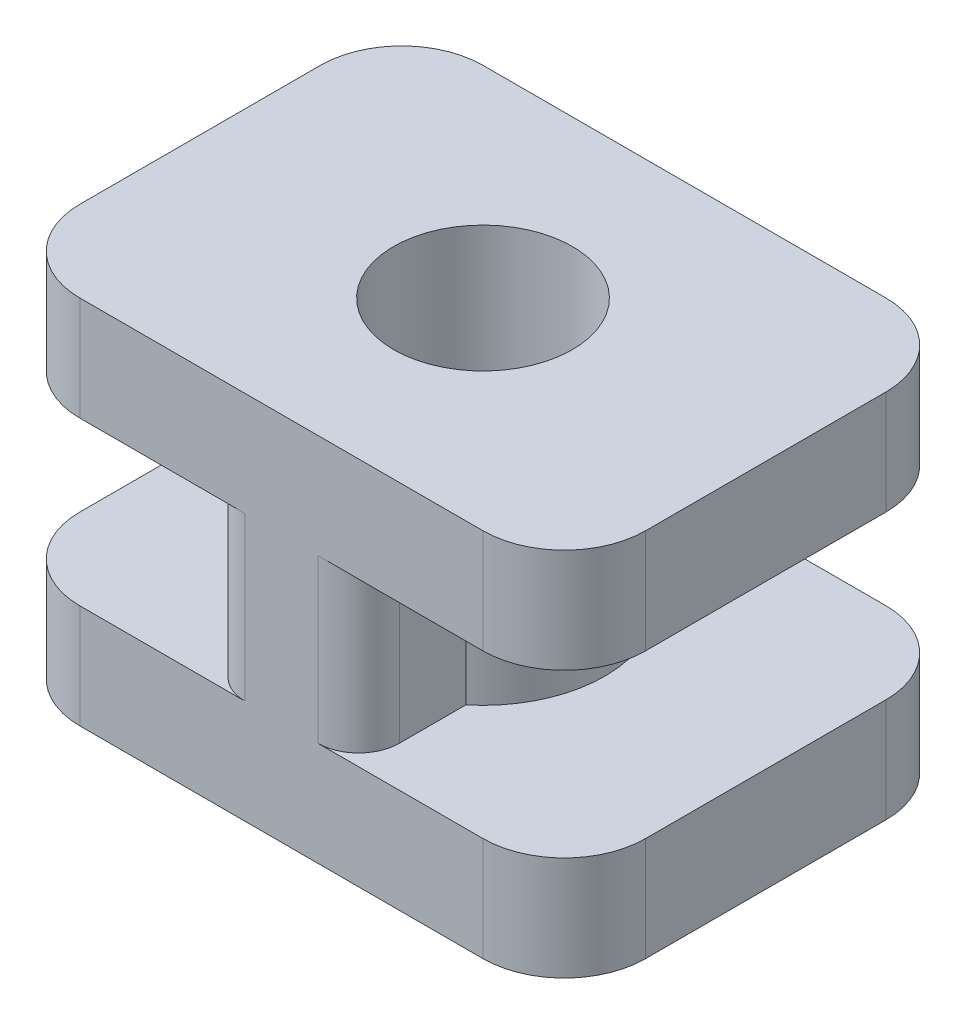
ISO-10303-21;
HEADER;
FILE_DESCRIPTION(('STEP AP214'),'2;1');
FILE_NAME('part.step','',(''),(''),'','','');
FILE_SCHEMA(('AUTOMOTIVE_DESIGN { 1 0 10303 214 1 1 1 1 }'));
ENDSEC;
DATA;
#1=APPLICATION_CONTEXT('core data for automotive mechanical design processes');
#2=APPLICATION_PROTOCOL_DEFINITION('international standard','automotive_design',2000,#1);
#3=PRODUCT_CONTEXT('',#1,'mechanical');
#4=PRODUCT('Part','Part','',(#3));
#5=PRODUCT_RELATED_PRODUCT_CATEGORY('part','',(#4));
#6=PRODUCT_DEFINITION_FORMATION('','',#4);
#7=PRODUCT_DEFINITION_CONTEXT('part definition',#1,'design');
#8=PRODUCT_DEFINITION('design','',#6,#7);
#9=PRODUCT_DEFINITION_SHAPE('','',#8);
#10=(LENGTH_UNIT() NAMED_UNIT(*) SI_UNIT(.MILLI.,.METRE.));
#11=(NAMED_UNIT(*) PLANE_ANGLE_UNIT() SI_UNIT($,.RADIAN.));
#12=(NAMED_UNIT(*) SI_UNIT($,.STERADIAN.) SOLID_ANGLE_UNIT());
#13=UNCERTAINTY_MEASURE_WITH_UNIT(LENGTH_MEASURE(1.E-05),#10,'distance_accuracy_value','');
#14=(GEOMETRIC_REPRESENTATION_CONTEXT(3) GLOBAL_UNCERTAINTY_ASSIGNED_CONTEXT((#13)) GLOBAL_UNIT_ASSIGNED_CONTEXT((#10,
#11,#12)) REPRESENTATION_CONTEXT('',''));
#15=CARTESIAN_POINT('',(0.,0.,0.));
#16=DIRECTION('',(0.,0.,1.));
#17=DIRECTION('',(1.,0.,0.));
#18=AXIS2_PLACEMENT_3D('',#15,#16,#17);
#19=CARTESIAN_POINT('',(1.2065,1.6256,3.1496));
#20=DIRECTION('',(-1.,0.,0.));
#21=DIRECTION('',(0.,0.,1.));
#22=AXIS2_PLACEMENT_3D('',#19,#20,#21);
#23=PLANE('',#22);
#24=DIRECTION('',(0.,0.,1.));
#25=VECTOR('',#24,1.);
#26=CARTESIAN_POINT('',(1.2065,4.1656,3.1496));
#27=LINE('',#26,#25);
#28=CARTESIAN_POINT('',(1.2065,4.1656,1.47423971931298));
#29=VERTEX_POINT('',#28);
#30=CARTESIAN_POINT('',(1.2065,4.1656,2.5146));
#31=VERTEX_POINT('',#30);
#32=EDGE_CURVE('E354',#29,#31,#27,.T.);
#33=ORIENTED_EDGE('',*,*,#32,.T.);
#34=DIRECTION('',(0.,1.,0.));
#35=VECTOR('',#34,1.);
#36=CARTESIAN_POINT('',(1.2065,1.6256,2.5146));
#37=LINE('',#36,#35);
#38=CARTESIAN_POINT('',(1.2065,1.6256,2.5146));
#39=VERTEX_POINT('',#38);
#40=EDGE_CURVE('E203',#31,#39,#37,.F.);
#41=ORIENTED_EDGE('',*,*,#40,.T.);
#42=DIRECTION('',(0.,0.,1.));
#43=VECTOR('',#42,1.);
#44=CARTESIAN_POINT('',(1.2065,1.6256,3.1496));
#45=LINE('',#44,#43);
#46=CARTESIAN_POINT('',(1.2065,1.6256,1.47423971931298));
#47=VERTEX_POINT('',#46);
#48=EDGE_CURVE('E187',#47,#39,#45,.T.);
#49=ORIENTED_EDGE('',*,*,#48,.F.);
#50=DIRECTION('',(0.,1.,0.));
#51=VECTOR('',#50,1.);
#52=CARTESIAN_POINT('',(1.2065,1.6256,1.47423971931298));
#53=LINE('',#52,#51);
#54=EDGE_CURVE('E200',#47,#29,#53,.T.);
#55=ORIENTED_EDGE('',*,*,#54,.T.);
#56=EDGE_LOOP('',(#33,#41,#49,#55));
#57=FACE_BOUND('',#56,.T.);
#58=ADVANCED_FACE('F32',(#57),#23,.F.);
#59=CARTESIAN_POINT('',(4.4196,5.7912,-3.1496));
#60=DIRECTION('',(1.,0.,0.));
#61=DIRECTION('',(0.,0.,-1.));
#62=AXIS2_PLACEMENT_3D('',#59,#60,#61);
#63=PLANE('',#62);
#64=DIRECTION('',(0.,0.,1.));
#65=VECTOR('',#64,1.);
#66=CARTESIAN_POINT('',(4.4196,4.1656,-3.1496));
#67=LINE('',#66,#65);
#68=CARTESIAN_POINT('',(4.4196,4.1656,-1.8796));
#69=VERTEX_POINT('',#68);
#70=CARTESIAN_POINT('',(4.4196,4.1656,1.8796));
#71=VERTEX_POINT('',#70);
#72=EDGE_CURVE('E210',#69,#71,#67,.T.);
#73=ORIENTED_EDGE('',*,*,#72,.F.);
#74=DIRECTION('',(0.,-1.,0.));
#75=VECTOR('',#74,1.);
#76=CARTESIAN_POINT('',(4.4196,5.7912,-1.8796));
#77=LINE('',#76,#75);
#78=CARTESIAN_POINT('',(4.4196,5.7912,-1.8796));
#79=VERTEX_POINT('',#78);
#80=EDGE_CURVE('E314',#69,#79,#77,.F.);
#81=ORIENTED_EDGE('',*,*,#80,.T.);
#82=DIRECTION('',(0.,0.,1.));
#83=VECTOR('',#82,1.);
#84=CARTESIAN_POINT('',(4.4196,5.7912,-3.1496));
#85=LINE('',#84,#83);
#86=CARTESIAN_POINT('',(4.4196,5.7912,1.8796));
#87=VERTEX_POINT('',#86);
#88=EDGE_CURVE('E219',#79,#87,#85,.T.);
#89=ORIENTED_EDGE('',*,*,#88,.T.);
#90=DIRECTION('',(0.,-1.,0.));
#91=VECTOR('',#90,1.);
#92=CARTESIAN_POINT('',(4.4196,5.7912,1.8796));
#93=LINE('',#92,#91);
#94=EDGE_CURVE('E311',#87,#71,#93,.T.);
#95=ORIENTED_EDGE('',*,*,#94,.T.);
#96=EDGE_LOOP('',(#73,#81,#89,#95));
#97=FACE_BOUND('',#96,.T.);
#98=ADVANCED_FACE('F337',(#97),#63,.T.);
#99=CARTESIAN_POINT('',(-4.4196,5.7912,-3.1496));
#100=DIRECTION('',(0.,0.,-1.));
#101=DIRECTION('',(-1.,0.,0.));
#102=AXIS2_PLACEMENT_3D('',#99,#100,#101);
#103=PLANE('',#102);
#104=DIRECTION('',(1.,0.,0.));
#105=VECTOR('',#104,1.);
#106=CARTESIAN_POINT('',(-4.4196,5.7912,-3.1496));
#107=LINE('',#106,#105);
#108=CARTESIAN_POINT('',(-3.1496,5.7912,-3.1496));
#109=VERTEX_POINT('',#108);
#110=CARTESIAN_POINT('',(3.1496,5.7912,-3.1496));
#111=VERTEX_POINT('',#110);
#112=EDGE_CURVE('E228',#109,#111,#107,.T.);
#113=ORIENTED_EDGE('',*,*,#112,.T.);
#114=DIRECTION('',(0.,-1.,0.));
#115=VECTOR('',#114,1.);
#116=CARTESIAN_POINT('',(3.1496,5.7912,-3.1496));
#117=LINE('',#116,#115);
#118=CARTESIAN_POINT('',(3.1496,4.1656,-3.1496));
#119=VERTEX_POINT('',#118);
#120=EDGE_CURVE('E300',#111,#119,#117,.T.);
#121=ORIENTED_EDGE('',*,*,#120,.T.);
#122=DIRECTION('',(1.,0.,0.));
#123=VECTOR('',#122,1.);
#124=CARTESIAN_POINT('',(-4.4196,4.1656,-3.1496));
#125=LINE('',#124,#123);
#126=CARTESIAN_POINT('',(-3.1496,4.1656,-3.1496));
#127=VERTEX_POINT('',#126);
#128=EDGE_CURVE('E223',#127,#119,#125,.T.);
#129=ORIENTED_EDGE('',*,*,#128,.F.);
#130=DIRECTION('',(0.,-1.,0.));
#131=VECTOR('',#130,1.);
#132=CARTESIAN_POINT('',(-3.1496,5.7912,-3.1496));
#133=LINE('',#132,#131);
#134=EDGE_CURVE('E298',#127,#109,#133,.F.);
#135=ORIENTED_EDGE('',*,*,#134,.T.);
#136=EDGE_LOOP('',(#113,#121,#129,#135));
#137=FACE_BOUND('',#136,.T.);
#138=ADVANCED_FACE('F329',(#137),#103,.T.);
#139=CARTESIAN_POINT('',(-4.4196,5.7912,3.1496));
#140=DIRECTION('',(-1.,0.,0.));
#141=DIRECTION('',(0.,0.,1.));
#142=AXIS2_PLACEMENT_3D('',#139,#140,#141);
#143=PLANE('',#142);
#144=DIRECTION('',(0.,0.,-1.));
#145=VECTOR('',#144,1.);
#146=CARTESIAN_POINT('',(-4.4196,5.7912,3.1496));
#147=LINE('',#146,#145);
#148=CARTESIAN_POINT('',(-4.4196,5.7912,1.8796));
#149=VERTEX_POINT('',#148);
#150=CARTESIAN_POINT('',(-4.4196,5.7912,-1.8796));
#151=VERTEX_POINT('',#150);
#152=EDGE_CURVE('E226',#149,#151,#147,.T.);
#153=ORIENTED_EDGE('',*,*,#152,.T.);
#154=DIRECTION('',(0.,-1.,0.));
#155=VECTOR('',#154,1.);
#156=CARTESIAN_POINT('',(-4.4196,5.7912,-1.8796));
#157=LINE('',#156,#155);
#158=CARTESIAN_POINT('',(-4.4196,4.1656,-1.8796));
#159=VERTEX_POINT('',#158);
#160=EDGE_CURVE('E11',#151,#159,#157,.T.);
#161=ORIENTED_EDGE('',*,*,#160,.T.);
#162=DIRECTION('',(0.,0.,-1.));
#163=VECTOR('',#162,1.);
#164=CARTESIAN_POINT('',(-4.4196,4.1656,3.1496));
#165=LINE('',#164,#163);
#166=CARTESIAN_POINT('',(-4.4196,4.1656,1.8796));
#167=VERTEX_POINT('',#166);
#168=EDGE_CURVE('E234',#167,#159,#165,.T.);
#169=ORIENTED_EDGE('',*,*,#168,.F.);
#170=DIRECTION('',(0.,-1.,0.));
#171=VECTOR('',#170,1.);
#172=CARTESIAN_POINT('',(-4.4196,5.7912,1.8796));
#173=LINE('',#172,#171);
#174=EDGE_CURVE('E40',#167,#149,#173,.F.);
#175=ORIENTED_EDGE('',*,*,#174,.T.);
#176=EDGE_LOOP('',(#153,#161,#169,#175));
#177=FACE_BOUND('',#176,.T.);
#178=ADVANCED_FACE('F397',(#177),#143,.T.);
#179=CARTESIAN_POINT('',(4.4196,5.7912,3.1496));
#180=DIRECTION('',(0.,0.,1.));
#181=DIRECTION('',(1.,0.,0.));
#182=AXIS2_PLACEMENT_3D('',#179,#180,#181);
#183=PLANE('',#182);
#184=DIRECTION('',(-1.,0.,0.));
#185=VECTOR('',#184,1.);
#186=CARTESIAN_POINT('',(-4.4196,1.6256,3.1496));
#187=LINE('',#186,#185);
#188=CARTESIAN_POINT('',(-0.5715,1.6256,3.1496));
#189=VERTEX_POINT('',#188);
#190=CARTESIAN_POINT('',(-3.1496,1.6256,3.1496));
#191=VERTEX_POINT('',#190);
#192=EDGE_CURVE('E367',#189,#191,#187,.T.);
#193=ORIENTED_EDGE('',*,*,#192,.T.);
#194=DIRECTION('',(0.,1.,0.));
#195=VECTOR('',#194,1.);
#196=CARTESIAN_POINT('',(-3.1496,0.,3.1496));
#197=LINE('',#196,#195);
#198=CARTESIAN_POINT('',(-3.1496,0.,3.1496));
#199=VERTEX_POINT('',#198);
#200=EDGE_CURVE('E296',#191,#199,#197,.F.);
#201=ORIENTED_EDGE('',*,*,#200,.T.);
#202=DIRECTION('',(-1.,0.,0.));
#203=VECTOR('',#202,1.);
#204=CARTESIAN_POINT('',(-4.4196,0.,3.1496));
#205=LINE('',#204,#203);
#206=CARTESIAN_POINT('',(3.1496,0.,3.1496));
#207=VERTEX_POINT('',#206);
#208=EDGE_CURVE('E363',#207,#199,#205,.T.);
#209=ORIENTED_EDGE('',*,*,#208,.F.);
#210=DIRECTION('',(0.,-1.,0.));
#211=VECTOR('',#210,1.);
#212=CARTESIAN_POINT('',(3.1496,1.6256,3.1496));
#213=LINE('',#212,#211);
#214=CARTESIAN_POINT('',(3.1496,1.6256,3.1496));
#215=VERTEX_POINT('',#214);
#216=EDGE_CURVE('E294',#207,#215,#213,.F.);
#217=ORIENTED_EDGE('',*,*,#216,.T.);
#218=DIRECTION('',(-1.,0.,0.));
#219=VECTOR('',#218,1.);
#220=CARTESIAN_POINT('',(4.4196,1.6256,3.1496));
#221=LINE('',#220,#219);
#222=CARTESIAN_POINT('',(0.571499999999999,1.6256,3.1496));
#223=VERTEX_POINT('',#222);
#224=EDGE_CURVE('E351',#215,#223,#221,.T.);
#225=ORIENTED_EDGE('',*,*,#224,.T.);
#226=DIRECTION('',(0.,1.,0.));
#227=VECTOR('',#226,1.);
#228=CARTESIAN_POINT('',(0.571499999999999,4.1656,3.1496));
#229=LINE('',#228,#227);
#230=CARTESIAN_POINT('',(0.571499999999999,4.1656,3.1496));
#231=VERTEX_POINT('',#230);
#232=EDGE_CURVE('E241',#223,#231,#229,.T.);
#233=ORIENTED_EDGE('',*,*,#232,.T.);
#234=DIRECTION('',(-1.,0.,0.));
#235=VECTOR('',#234,1.);
#236=CARTESIAN_POINT('',(4.4196,4.1656,3.1496));
#237=LINE('',#236,#235);
#238=CARTESIAN_POINT('',(3.1496,4.1656,3.1496));
#239=VERTEX_POINT('',#238);
#240=EDGE_CURVE('E232',#239,#231,#237,.T.);
#241=ORIENTED_EDGE('',*,*,#240,.F.);
#242=DIRECTION('',(0.,-1.,0.));
#243=VECTOR('',#242,1.);
#244=CARTESIAN_POINT('',(3.1496,5.7912,3.1496));
#245=LINE('',#244,#243);
#246=CARTESIAN_POINT('',(3.1496,5.7912,3.1496));
#247=VERTEX_POINT('',#246);
#248=EDGE_CURVE('E292',#239,#247,#245,.F.);
#249=ORIENTED_EDGE('',*,*,#248,.T.);
#250=DIRECTION('',(-1.,0.,0.));
#251=VECTOR('',#250,1.);
#252=CARTESIAN_POINT('',(4.4196,5.7912,3.1496));
#253=LINE('',#252,#251);
#254=CARTESIAN_POINT('',(-3.1496,5.7912,3.1496));
#255=VERTEX_POINT('',#254);
#256=EDGE_CURVE('E222',#247,#255,#253,.T.);
#257=ORIENTED_EDGE('',*,*,#256,.T.);
#258=DIRECTION('',(0.,-1.,0.));
#259=VECTOR('',#258,1.);
#260=CARTESIAN_POINT('',(-3.1496,5.7912,3.1496));
#261=LINE('',#260,#259);
#262=CARTESIAN_POINT('',(-3.1496,4.1656,3.1496));
#263=VERTEX_POINT('',#262);
#264=EDGE_CURVE('E289',#255,#263,#261,.T.);
#265=ORIENTED_EDGE('',*,*,#264,.T.);
#266=CARTESIAN_POINT('',(-0.5715,4.1656,3.1496));
#267=VERTEX_POINT('',#266);
#268=EDGE_CURVE('E214',#267,#263,#237,.T.);
#269=ORIENTED_EDGE('',*,*,#268,.F.);
#270=DIRECTION('',(0.,1.,0.));
#271=VECTOR('',#270,1.);
#272=CARTESIAN_POINT('',(-0.5715,1.6256,3.1496));
#273=LINE('',#272,#271);
#274=EDGE_CURVE('E230',#267,#189,#273,.F.);
#275=ORIENTED_EDGE('',*,*,#274,.T.);
#276=EDGE_LOOP('',(#193,#201,#209,#217,#225,#233,#241,#249,#257,#265,#269,#275));
#277=FACE_BOUND('',#276,.T.);
#278=ADVANCED_FACE('F347',(#277),#183,.T.);
#279=CARTESIAN_POINT('',(0.,5.7912,0.));
#280=DIRECTION('',(0.,-1.,0.));
#281=DIRECTION('',(0.,0.,-1.));
#282=AXIS2_PLACEMENT_3D('',#279,#280,#281);
#283=PLANE('',#282);
#284=CARTESIAN_POINT('',(0.,5.7912,0.));
#285=DIRECTION('',(0.,1.,0.));
#286=DIRECTION('',(0.,0.,1.));
#287=AXIS2_PLACEMENT_3D('',#284,#285,#286);
#288=CIRCLE('',#287,1.39699999999999);
#289=CARTESIAN_POINT('',(0.,5.7912,1.39699999999999));
#290=VERTEX_POINT('',#289);
#291=EDGE_CURVE('E384',#290,#290,#288,.T.);
#292=ORIENTED_EDGE('',*,*,#291,.F.);
#293=EDGE_LOOP('',(#292));
#294=FACE_BOUND('',#293,.T.);
#295=ORIENTED_EDGE('',*,*,#88,.F.);
#296=CARTESIAN_POINT('',(3.1496,5.7912,-1.8796));
#297=DIRECTION('',(0.,-1.,0.));
#298=DIRECTION('',(0.,0.,-1.));
#299=AXIS2_PLACEMENT_3D('',#296,#297,#298);
#300=CIRCLE('',#299,1.27);
#301=EDGE_CURVE('E321',#79,#111,#300,.F.);
#302=ORIENTED_EDGE('',*,*,#301,.T.);
#303=ORIENTED_EDGE('',*,*,#112,.F.);
#304=CARTESIAN_POINT('',(-3.1496,5.7912,-1.8796));
#305=DIRECTION('',(0.,-1.,0.));
#306=DIRECTION('',(0.,0.,-1.));
#307=AXIS2_PLACEMENT_3D('',#304,#305,#306);
#308=CIRCLE('',#307,1.27);
#309=EDGE_CURVE('E47',#109,#151,#308,.F.);
#310=ORIENTED_EDGE('',*,*,#309,.T.);
#311=ORIENTED_EDGE('',*,*,#152,.F.);
#312=CARTESIAN_POINT('',(-3.1496,5.7912,1.8796));
#313=DIRECTION('',(0.,-1.,0.));
#314=DIRECTION('',(0.,0.,-1.));
#315=AXIS2_PLACEMENT_3D('',#312,#313,#314);
#316=CIRCLE('',#315,1.27);
#317=EDGE_CURVE('E316',#149,#255,#316,.F.);
#318=ORIENTED_EDGE('',*,*,#317,.T.);
#319=ORIENTED_EDGE('',*,*,#256,.F.);
#320=CARTESIAN_POINT('',(3.1496,5.7912,1.8796));
#321=DIRECTION('',(0.,-1.,0.));
#322=DIRECTION('',(0.,0.,-1.));
#323=AXIS2_PLACEMENT_3D('',#320,#321,#322);
#324=CIRCLE('',#323,1.27);
#325=EDGE_CURVE('E318',#247,#87,#324,.F.);
#326=ORIENTED_EDGE('',*,*,#325,.T.);
#327=EDGE_LOOP('',(#295,#302,#303,#310,#311,#318,#319,#326));
#328=FACE_BOUND('',#327,.T.);
#329=ADVANCED_FACE('F324',(#294,#328),#283,.F.);
#330=CARTESIAN_POINT('',(0.,4.1656,0.));
#331=DIRECTION('',(0.,-1.,0.));
#332=DIRECTION('',(0.,0.,-1.));
#333=AXIS2_PLACEMENT_3D('',#330,#331,#332);
#334=PLANE('',#333);
#335=ORIENTED_EDGE('',*,*,#128,.T.);
#336=CARTESIAN_POINT('',(3.1496,4.1656,-1.8796));
#337=DIRECTION('',(0.,-1.,0.));
#338=DIRECTION('',(0.,0.,-1.));
#339=AXIS2_PLACEMENT_3D('',#336,#337,#338);
#340=CIRCLE('',#339,1.27);
#341=EDGE_CURVE('E309',#119,#69,#340,.T.);
#342=ORIENTED_EDGE('',*,*,#341,.T.);
#343=ORIENTED_EDGE('',*,*,#72,.T.);
#344=CARTESIAN_POINT('',(3.1496,4.1656,1.8796));
#345=DIRECTION('',(0.,-1.,0.));
#346=DIRECTION('',(0.,0.,-1.));
#347=AXIS2_PLACEMENT_3D('',#344,#345,#346);
#348=CIRCLE('',#347,1.27);
#349=EDGE_CURVE('E305',#71,#239,#348,.T.);
#350=ORIENTED_EDGE('',*,*,#349,.T.);
#351=ORIENTED_EDGE('',*,*,#240,.T.);
#352=CARTESIAN_POINT('',(0.571499999999999,4.1656,2.5146));
#353=DIRECTION('',(0.,-1.,0.));
#354=DIRECTION('',(0.,0.,-1.));
#355=AXIS2_PLACEMENT_3D('',#352,#353,#354);
#356=CIRCLE('',#355,0.635);
#357=EDGE_CURVE('E248',#231,#31,#356,.F.);
#358=ORIENTED_EDGE('',*,*,#357,.T.);
#359=ORIENTED_EDGE('',*,*,#32,.F.);
#360=CARTESIAN_POINT('',(0.,4.1656,0.));
#361=DIRECTION('',(0.,-1.,0.));
#362=DIRECTION('',(0.,0.,1.));
#363=AXIS2_PLACEMENT_3D('',#360,#361,#362);
#364=CIRCLE('',#363,1.905);
#365=CARTESIAN_POINT('',(-1.2065,4.1656,1.47423971931297));
#366=VERTEX_POINT('',#365);
#367=EDGE_CURVE('E209',#366,#29,#364,.T.);
#368=ORIENTED_EDGE('',*,*,#367,.F.);
#369=DIRECTION('',(0.,0.,-1.));
#370=VECTOR('',#369,1.);
#371=CARTESIAN_POINT('',(-1.2065,4.1656,1.47423971931297));
#372=LINE('',#371,#370);
#373=CARTESIAN_POINT('',(-1.2065,4.1656,2.5146));
#374=VERTEX_POINT('',#373);
#375=EDGE_CURVE('E195',#374,#366,#372,.T.);
#376=ORIENTED_EDGE('',*,*,#375,.F.);
#377=CARTESIAN_POINT('',(-0.5715,4.1656,2.5146));
#378=DIRECTION('',(0.,-1.,0.));
#379=DIRECTION('',(0.,0.,-1.));
#380=AXIS2_PLACEMENT_3D('',#377,#378,#379);
#381=CIRCLE('',#380,0.635);
#382=EDGE_CURVE('E252',#374,#267,#381,.F.);
#383=ORIENTED_EDGE('',*,*,#382,.T.);
#384=ORIENTED_EDGE('',*,*,#268,.T.);
#385=CARTESIAN_POINT('',(-3.1496,4.1656,1.8796));
#386=DIRECTION('',(0.,-1.,0.));
#387=DIRECTION('',(0.,0.,-1.));
#388=AXIS2_PLACEMENT_3D('',#385,#386,#387);
#389=CIRCLE('',#388,1.27);
#390=EDGE_CURVE('E303',#263,#167,#389,.T.);
#391=ORIENTED_EDGE('',*,*,#390,.T.);
#392=ORIENTED_EDGE('',*,*,#168,.T.);
#393=CARTESIAN_POINT('',(-3.1496,4.1656,-1.8796));
#394=DIRECTION('',(0.,-1.,0.));
#395=DIRECTION('',(0.,0.,-1.));
#396=AXIS2_PLACEMENT_3D('',#393,#394,#395);
#397=CIRCLE('',#396,1.27);
#398=EDGE_CURVE('E307',#159,#127,#397,.T.);
#399=ORIENTED_EDGE('',*,*,#398,.T.);
#400=EDGE_LOOP('',(#335,#342,#343,#350,#351,#358,#359,#368,#376,#383,#384,#391,#392,#399));
#401=FACE_BOUND('',#400,.T.);
#402=ADVANCED_FACE('F335',(#401),#334,.T.);
#403=CARTESIAN_POINT('',(0.,1.6256,0.));
#404=DIRECTION('',(0.,1.,0.));
#405=DIRECTION('',(0.,0.,1.));
#406=AXIS2_PLACEMENT_3D('',#403,#404,#405);
#407=CYLINDRICAL_SURFACE('',#406,1.905);
#408=ORIENTED_EDGE('',*,*,#367,.T.);
#409=ORIENTED_EDGE('',*,*,#54,.F.);
#410=CARTESIAN_POINT('',(0.,1.6256,0.));
#411=DIRECTION('',(0.,-1.,0.));
#412=DIRECTION('',(0.,0.,1.));
#413=AXIS2_PLACEMENT_3D('',#410,#411,#412);
#414=CIRCLE('',#413,1.905);
#415=CARTESIAN_POINT('',(-1.2065,1.6256,1.47423971931297));
#416=VERTEX_POINT('',#415);
#417=EDGE_CURVE('E182',#416,#47,#414,.T.);
#418=ORIENTED_EDGE('',*,*,#417,.F.);
#419=DIRECTION('',(0.,1.,0.));
#420=VECTOR('',#419,1.);
#421=CARTESIAN_POINT('',(-1.2065,1.6256,1.47423971931297));
#422=LINE('',#421,#420);
#423=EDGE_CURVE('E211',#416,#366,#422,.T.);
#424=ORIENTED_EDGE('',*,*,#423,.T.);
#425=EDGE_LOOP('',(#408,#409,#418,#424));
#426=FACE_BOUND('',#425,.T.);
#427=ADVANCED_FACE('F207',(#426),#407,.T.);
#428=CARTESIAN_POINT('',(-1.2065,1.6256,1.47423971931297));
#429=DIRECTION('',(1.,0.,0.));
#430=DIRECTION('',(0.,0.,-1.));
#431=AXIS2_PLACEMENT_3D('',#428,#429,#430);
#432=PLANE('',#431);
#433=DIRECTION('',(0.,0.,-1.));
#434=VECTOR('',#433,1.);
#435=CARTESIAN_POINT('',(-1.2065,1.6256,1.47423971931297));
#436=LINE('',#435,#434);
#437=CARTESIAN_POINT('',(-1.2065,1.6256,2.5146));
#438=VERTEX_POINT('',#437);
#439=EDGE_CURVE('E190',#438,#416,#436,.T.);
#440=ORIENTED_EDGE('',*,*,#439,.F.);
#441=DIRECTION('',(0.,1.,0.));
#442=VECTOR('',#441,1.);
#443=CARTESIAN_POINT('',(-1.2065,4.1656,2.5146));
#444=LINE('',#443,#442);
#445=EDGE_CURVE('E245',#438,#374,#444,.T.);
#446=ORIENTED_EDGE('',*,*,#445,.T.);
#447=ORIENTED_EDGE('',*,*,#375,.T.);
#448=ORIENTED_EDGE('',*,*,#423,.F.);
#449=EDGE_LOOP('',(#440,#446,#447,#448));
#450=FACE_BOUND('',#449,.T.);
#451=ADVANCED_FACE('F407',(#450),#432,.F.);
#452=CARTESIAN_POINT('',(-4.4196,0.,-3.1496));
#453=DIRECTION('',(1.,0.,0.));
#454=DIRECTION('',(0.,0.,-1.));
#455=AXIS2_PLACEMENT_3D('',#452,#453,#454);
#456=PLANE('',#455);
#457=DIRECTION('',(0.,0.,-1.));
#458=VECTOR('',#457,1.);
#459=CARTESIAN_POINT('',(-4.4196,0.,-3.1496));
#460=LINE('',#459,#458);
#461=CARTESIAN_POINT('',(-4.4196,0.,1.8796));
#462=VERTEX_POINT('',#461);
#463=CARTESIAN_POINT('',(-4.4196,0.,-1.8796));
#464=VERTEX_POINT('',#463);
#465=EDGE_CURVE('E371',#462,#464,#460,.T.);
#466=ORIENTED_EDGE('',*,*,#465,.F.);
#467=DIRECTION('',(0.,1.,0.));
#468=VECTOR('',#467,1.);
#469=CARTESIAN_POINT('',(-4.4196,1.6256,1.8796));
#470=LINE('',#469,#468);
#471=CARTESIAN_POINT('',(-4.4196,1.6256,1.8796));
#472=VERTEX_POINT('',#471);
#473=EDGE_CURVE('E286',#462,#472,#470,.T.);
#474=ORIENTED_EDGE('',*,*,#473,.T.);
#475=DIRECTION('',(0.,0.,-1.));
#476=VECTOR('',#475,1.);
#477=CARTESIAN_POINT('',(-4.4196,1.6256,-3.1496));
#478=LINE('',#477,#476);
#479=CARTESIAN_POINT('',(-4.4196,1.6256,-1.8796));
#480=VERTEX_POINT('',#479);
#481=EDGE_CURVE('E364',#472,#480,#478,.T.);
#482=ORIENTED_EDGE('',*,*,#481,.T.);
#483=DIRECTION('',(0.,1.,0.));
#484=VECTOR('',#483,1.);
#485=CARTESIAN_POINT('',(-4.4196,0.,-1.8796));
#486=LINE('',#485,#484);
#487=EDGE_CURVE('E284',#480,#464,#486,.F.);
#488=ORIENTED_EDGE('',*,*,#487,.T.);
#489=EDGE_LOOP('',(#466,#474,#482,#488));
#490=FACE_BOUND('',#489,.T.);
#491=ADVANCED_FACE('F413',(#490),#456,.F.);
#492=CARTESIAN_POINT('',(1.2065,0.,-3.1496));
#493=DIRECTION('',(0.,0.,1.));
#494=DIRECTION('',(1.,0.,0.));
#495=AXIS2_PLACEMENT_3D('',#492,#493,#494);
#496=PLANE('',#495);
#497=DIRECTION('',(1.,0.,0.));
#498=VECTOR('',#497,1.);
#499=CARTESIAN_POINT('',(1.2065,1.6256,-3.1496));
#500=LINE('',#499,#498);
#501=CARTESIAN_POINT('',(-3.1496,1.6256,-3.1496));
#502=VERTEX_POINT('',#501);
#503=CARTESIAN_POINT('',(3.1496,1.6256,-3.1496));
#504=VERTEX_POINT('',#503);
#505=EDGE_CURVE('E360',#502,#504,#500,.T.);
#506=ORIENTED_EDGE('',*,*,#505,.T.);
#507=DIRECTION('',(0.,1.,0.));
#508=VECTOR('',#507,1.);
#509=CARTESIAN_POINT('',(3.1496,0.,-3.1496));
#510=LINE('',#509,#508);
#511=CARTESIAN_POINT('',(3.1496,0.,-3.1496));
#512=VERTEX_POINT('',#511);
#513=EDGE_CURVE('E274',#504,#512,#510,.F.);
#514=ORIENTED_EDGE('',*,*,#513,.T.);
#515=DIRECTION('',(1.,0.,0.));
#516=VECTOR('',#515,1.);
#517=CARTESIAN_POINT('',(1.2065,0.,-3.1496));
#518=LINE('',#517,#516);
#519=CARTESIAN_POINT('',(-3.1496,0.,-3.1496));
#520=VERTEX_POINT('',#519);
#521=EDGE_CURVE('E356',#520,#512,#518,.T.);
#522=ORIENTED_EDGE('',*,*,#521,.F.);
#523=DIRECTION('',(0.,1.,0.));
#524=VECTOR('',#523,1.);
#525=CARTESIAN_POINT('',(-3.1496,0.,-3.1496));
#526=LINE('',#525,#524);
#527=EDGE_CURVE('E271',#520,#502,#526,.T.);
#528=ORIENTED_EDGE('',*,*,#527,.T.);
#529=EDGE_LOOP('',(#506,#514,#522,#528));
#530=FACE_BOUND('',#529,.T.);
#531=ADVANCED_FACE('F418',(#530),#496,.F.);
#532=CARTESIAN_POINT('',(0.,0.,0.));
#533=DIRECTION('',(0.,1.,0.));
#534=DIRECTION('',(0.,0.,1.));
#535=AXIS2_PLACEMENT_3D('',#532,#533,#534);
#536=PLANE('',#535);
#537=CARTESIAN_POINT('',(0.,0.,0.));
#538=DIRECTION('',(0.,1.,0.));
#539=DIRECTION('',(0.,0.,1.));
#540=AXIS2_PLACEMENT_3D('',#537,#538,#539);
#541=CIRCLE('',#540,1.39699999999999);
#542=CARTESIAN_POINT('',(0.,0.,1.39699999999999));
#543=VERTEX_POINT('',#542);
#544=EDGE_CURVE('E205',#543,#543,#541,.T.);
#545=ORIENTED_EDGE('',*,*,#544,.T.);
#546=EDGE_LOOP('',(#545));
#547=FACE_BOUND('',#546,.T.);
#548=ORIENTED_EDGE('',*,*,#521,.T.);
#549=CARTESIAN_POINT('',(3.1496,0.,-1.8796));
#550=DIRECTION('',(0.,1.,0.));
#551=DIRECTION('',(0.,0.,1.));
#552=AXIS2_PLACEMENT_3D('',#549,#550,#551);
#553=CIRCLE('',#552,1.27);
#554=CARTESIAN_POINT('',(4.4196,0.,-1.8796));
#555=VERTEX_POINT('',#554);
#556=EDGE_CURVE('E282',#512,#555,#553,.F.);
#557=ORIENTED_EDGE('',*,*,#556,.T.);
#558=DIRECTION('',(0.,0.,-1.));
#559=VECTOR('',#558,1.);
#560=CARTESIAN_POINT('',(4.4196,0.,-3.1496));
#561=LINE('',#560,#559);
#562=CARTESIAN_POINT('',(4.4196,0.,1.8796));
#563=VERTEX_POINT('',#562);
#564=EDGE_CURVE('E204',#563,#555,#561,.T.);
#565=ORIENTED_EDGE('',*,*,#564,.F.);
#566=CARTESIAN_POINT('',(3.1496,0.,1.8796));
#567=DIRECTION('',(0.,1.,0.));
#568=DIRECTION('',(0.,0.,1.));
#569=AXIS2_PLACEMENT_3D('',#566,#567,#568);
#570=CIRCLE('',#569,1.27);
#571=EDGE_CURVE('E276',#563,#207,#570,.F.);
#572=ORIENTED_EDGE('',*,*,#571,.T.);
#573=ORIENTED_EDGE('',*,*,#208,.T.);
#574=CARTESIAN_POINT('',(-3.1496,0.,1.8796));
#575=DIRECTION('',(0.,1.,0.));
#576=DIRECTION('',(0.,0.,1.));
#577=AXIS2_PLACEMENT_3D('',#574,#575,#576);
#578=CIRCLE('',#577,1.27);
#579=EDGE_CURVE('E280',#199,#462,#578,.F.);
#580=ORIENTED_EDGE('',*,*,#579,.T.);
#581=ORIENTED_EDGE('',*,*,#465,.T.);
#582=CARTESIAN_POINT('',(-3.1496,0.,-1.8796));
#583=DIRECTION('',(0.,1.,0.));
#584=DIRECTION('',(0.,0.,1.));
#585=AXIS2_PLACEMENT_3D('',#582,#583,#584);
#586=CIRCLE('',#585,1.27);
#587=EDGE_CURVE('E278',#464,#520,#586,.F.);
#588=ORIENTED_EDGE('',*,*,#587,.T.);
#589=EDGE_LOOP('',(#548,#557,#565,#572,#573,#580,#581,#588));
#590=FACE_BOUND('',#589,.T.);
#591=ADVANCED_FACE('F506',(#547,#590),#536,.F.);
#592=CARTESIAN_POINT('',(0.,1.6256,0.));
#593=DIRECTION('',(0.,1.,0.));
#594=DIRECTION('',(0.,0.,1.));
#595=AXIS2_PLACEMENT_3D('',#592,#593,#594);
#596=PLANE('',#595);
#597=DIRECTION('',(0.,0.,1.));
#598=VECTOR('',#597,1.);
#599=CARTESIAN_POINT('',(4.4196,1.6256,3.1496));
#600=LINE('',#599,#598);
#601=CARTESIAN_POINT('',(4.4196,1.6256,-1.8796));
#602=VERTEX_POINT('',#601);
#603=CARTESIAN_POINT('',(4.4196,1.6256,1.8796));
#604=VERTEX_POINT('',#603);
#605=EDGE_CURVE('E376',#602,#604,#600,.T.);
#606=ORIENTED_EDGE('',*,*,#605,.F.);
#607=CARTESIAN_POINT('',(3.1496,1.6256,-1.8796));
#608=DIRECTION('',(0.,1.,0.));
#609=DIRECTION('',(0.,0.,1.));
#610=AXIS2_PLACEMENT_3D('',#607,#608,#609);
#611=CIRCLE('',#610,1.27);
#612=EDGE_CURVE('E269',#602,#504,#611,.T.);
#613=ORIENTED_EDGE('',*,*,#612,.T.);
#614=ORIENTED_EDGE('',*,*,#505,.F.);
#615=CARTESIAN_POINT('',(-3.1496,1.6256,-1.8796));
#616=DIRECTION('',(0.,1.,0.));
#617=DIRECTION('',(0.,0.,1.));
#618=AXIS2_PLACEMENT_3D('',#615,#616,#617);
#619=CIRCLE('',#618,1.27);
#620=EDGE_CURVE('E265',#502,#480,#619,.T.);
#621=ORIENTED_EDGE('',*,*,#620,.T.);
#622=ORIENTED_EDGE('',*,*,#481,.F.);
#623=CARTESIAN_POINT('',(-3.1496,1.6256,1.8796));
#624=DIRECTION('',(0.,1.,0.));
#625=DIRECTION('',(0.,0.,1.));
#626=AXIS2_PLACEMENT_3D('',#623,#624,#625);
#627=CIRCLE('',#626,1.27);
#628=EDGE_CURVE('E267',#472,#191,#627,.T.);
#629=ORIENTED_EDGE('',*,*,#628,.T.);
#630=ORIENTED_EDGE('',*,*,#192,.F.);
#631=CARTESIAN_POINT('',(-0.5715,1.6256,2.5146));
#632=DIRECTION('',(0.,1.,0.));
#633=DIRECTION('',(0.,0.,1.));
#634=AXIS2_PLACEMENT_3D('',#631,#632,#633);
#635=CIRCLE('',#634,0.635);
#636=EDGE_CURVE('E255',#189,#438,#635,.F.);
#637=ORIENTED_EDGE('',*,*,#636,.T.);
#638=ORIENTED_EDGE('',*,*,#439,.T.);
#639=ORIENTED_EDGE('',*,*,#417,.T.);
#640=ORIENTED_EDGE('',*,*,#48,.T.);
#641=CARTESIAN_POINT('',(0.571499999999999,1.6256,2.5146));
#642=DIRECTION('',(0.,1.,0.));
#643=DIRECTION('',(0.,0.,1.));
#644=AXIS2_PLACEMENT_3D('',#641,#642,#643);
#645=CIRCLE('',#644,0.635);
#646=EDGE_CURVE('E250',#39,#223,#645,.F.);
#647=ORIENTED_EDGE('',*,*,#646,.T.);
#648=ORIENTED_EDGE('',*,*,#224,.F.);
#649=CARTESIAN_POINT('',(3.1496,1.6256,1.8796));
#650=DIRECTION('',(0.,1.,0.));
#651=DIRECTION('',(0.,0.,1.));
#652=AXIS2_PLACEMENT_3D('',#649,#650,#651);
#653=CIRCLE('',#652,1.27);
#654=EDGE_CURVE('E263',#215,#604,#653,.T.);
#655=ORIENTED_EDGE('',*,*,#654,.T.);
#656=EDGE_LOOP('',(#606,#613,#614,#621,#622,#629,#630,#637,#638,#639,#640,#647,#648,#655));
#657=FACE_BOUND('',#656,.T.);
#658=ADVANCED_FACE('F185',(#657),#596,.T.);
#659=CARTESIAN_POINT('',(4.4196,0.,0.));
#660=DIRECTION('',(-1.,0.,0.));
#661=DIRECTION('',(0.,0.,1.));
#662=AXIS2_PLACEMENT_3D('',#659,#660,#661);
#663=PLANE('',#662);
#664=ORIENTED_EDGE('',*,*,#564,.T.);
#665=DIRECTION('',(0.,1.,0.));
#666=VECTOR('',#665,1.);
#667=CARTESIAN_POINT('',(4.4196,0.,-1.8796));
#668=LINE('',#667,#666);
#669=EDGE_CURVE('E260',#555,#602,#668,.T.);
#670=ORIENTED_EDGE('',*,*,#669,.T.);
#671=ORIENTED_EDGE('',*,*,#605,.T.);
#672=DIRECTION('',(0.,-1.,0.));
#673=VECTOR('',#672,1.);
#674=CARTESIAN_POINT('',(4.4196,0.,1.8796));
#675=LINE('',#674,#673);
#676=EDGE_CURVE('E257',#604,#563,#675,.T.);
#677=ORIENTED_EDGE('',*,*,#676,.T.);
#678=EDGE_LOOP('',(#664,#670,#671,#677));
#679=FACE_BOUND('',#678,.T.);
#680=ADVANCED_FACE('F526',(#679),#663,.F.);
#681=CARTESIAN_POINT('',(0.,5.7912,0.));
#682=DIRECTION('',(0.,1.,0.));
#683=DIRECTION('',(0.,0.,1.));
#684=AXIS2_PLACEMENT_3D('',#681,#682,#683);
#685=CYLINDRICAL_SURFACE('',#684,1.39699999999999);
#686=ORIENTED_EDGE('',*,*,#544,.F.);
#687=EDGE_LOOP('',(#686));
#688=FACE_BOUND('',#687,.T.);
#689=ORIENTED_EDGE('',*,*,#291,.T.);
#690=EDGE_LOOP('',(#689));
#691=FACE_BOUND('',#690,.T.);
#692=ADVANCED_FACE('F388',(#688,#691),#685,.F.);
#693=CARTESIAN_POINT('',(0.571499999999999,5.7912,2.5146));
#694=DIRECTION('',(0.,-1.,0.));
#695=DIRECTION('',(0.,0.,-1.));
#696=AXIS2_PLACEMENT_3D('',#693,#694,#695);
#697=CYLINDRICAL_SURFACE('',#696,0.635);
#698=ORIENTED_EDGE('',*,*,#646,.F.);
#699=ORIENTED_EDGE('',*,*,#40,.F.);
#700=ORIENTED_EDGE('',*,*,#357,.F.);
#701=ORIENTED_EDGE('',*,*,#232,.F.);
#702=EDGE_LOOP('',(#698,#699,#700,#701));
#703=FACE_BOUND('',#702,.T.);
#704=ADVANCED_FACE('F353',(#703),#697,.T.);
#705=CARTESIAN_POINT('',(-0.5715,1.6256,2.5146));
#706=DIRECTION('',(0.,-1.,0.));
#707=DIRECTION('',(0.,0.,-1.));
#708=AXIS2_PLACEMENT_3D('',#705,#706,#707);
#709=CYLINDRICAL_SURFACE('',#708,0.635);
#710=ORIENTED_EDGE('',*,*,#636,.F.);
#711=ORIENTED_EDGE('',*,*,#274,.F.);
#712=ORIENTED_EDGE('',*,*,#382,.F.);
#713=ORIENTED_EDGE('',*,*,#445,.F.);
#714=EDGE_LOOP('',(#710,#711,#712,#713));
#715=FACE_BOUND('',#714,.T.);
#716=ADVANCED_FACE('F424',(#715),#709,.T.);
#717=CARTESIAN_POINT('',(3.1496,0.,-1.8796));
#718=DIRECTION('',(0.,1.,0.));
#719=DIRECTION('',(0.,0.,1.));
#720=AXIS2_PLACEMENT_3D('',#717,#718,#719);
#721=CYLINDRICAL_SURFACE('',#720,1.27);
#722=ORIENTED_EDGE('',*,*,#556,.F.);
#723=ORIENTED_EDGE('',*,*,#513,.F.);
#724=ORIENTED_EDGE('',*,*,#612,.F.);
#725=ORIENTED_EDGE('',*,*,#669,.F.);
#726=EDGE_LOOP('',(#722,#723,#724,#725));
#727=FACE_BOUND('',#726,.T.);
#728=ADVANCED_FACE('F452',(#727),#721,.T.);
#729=CARTESIAN_POINT('',(-3.1496,0.,1.8796));
#730=DIRECTION('',(0.,-1.,0.));
#731=DIRECTION('',(0.,0.,-1.));
#732=AXIS2_PLACEMENT_3D('',#729,#730,#731);
#733=CYLINDRICAL_SURFACE('',#732,1.27);
#734=ORIENTED_EDGE('',*,*,#579,.F.);
#735=ORIENTED_EDGE('',*,*,#200,.F.);
#736=ORIENTED_EDGE('',*,*,#628,.F.);
#737=ORIENTED_EDGE('',*,*,#473,.F.);
#738=EDGE_LOOP('',(#734,#735,#736,#737));
#739=FACE_BOUND('',#738,.T.);
#740=ADVANCED_FACE('F448',(#739),#733,.T.);
#741=CARTESIAN_POINT('',(-3.1496,0.,-1.8796));
#742=DIRECTION('',(0.,1.,0.));
#743=DIRECTION('',(0.,0.,1.));
#744=AXIS2_PLACEMENT_3D('',#741,#742,#743);
#745=CYLINDRICAL_SURFACE('',#744,1.27);
#746=ORIENTED_EDGE('',*,*,#587,.F.);
#747=ORIENTED_EDGE('',*,*,#487,.F.);
#748=ORIENTED_EDGE('',*,*,#620,.F.);
#749=ORIENTED_EDGE('',*,*,#527,.F.);
#750=EDGE_LOOP('',(#746,#747,#748,#749));
#751=FACE_BOUND('',#750,.T.);
#752=ADVANCED_FACE('F445',(#751),#745,.T.);
#753=CARTESIAN_POINT('',(3.1496,5.7912,-1.8796));
#754=DIRECTION('',(0.,-1.,0.));
#755=DIRECTION('',(0.,0.,-1.));
#756=AXIS2_PLACEMENT_3D('',#753,#754,#755);
#757=CYLINDRICAL_SURFACE('',#756,1.27);
#758=ORIENTED_EDGE('',*,*,#301,.F.);
#759=ORIENTED_EDGE('',*,*,#80,.F.);
#760=ORIENTED_EDGE('',*,*,#341,.F.);
#761=ORIENTED_EDGE('',*,*,#120,.F.);
#762=EDGE_LOOP('',(#758,#759,#760,#761));
#763=FACE_BOUND('',#762,.T.);
#764=ADVANCED_FACE('F332',(#763),#757,.T.);
#765=CARTESIAN_POINT('',(3.1496,0.,1.8796));
#766=DIRECTION('',(0.,1.,0.));
#767=DIRECTION('',(0.,0.,1.));
#768=AXIS2_PLACEMENT_3D('',#765,#766,#767);
#769=CYLINDRICAL_SURFACE('',#768,1.27);
#770=ORIENTED_EDGE('',*,*,#654,.F.);
#771=ORIENTED_EDGE('',*,*,#216,.F.);
#772=ORIENTED_EDGE('',*,*,#571,.F.);
#773=ORIENTED_EDGE('',*,*,#676,.F.);
#774=EDGE_LOOP('',(#770,#771,#772,#773));
#775=FACE_BOUND('',#774,.T.);
#776=ADVANCED_FACE('F434',(#775),#769,.T.);
#777=CARTESIAN_POINT('',(-3.1496,5.7912,-1.8796));
#778=DIRECTION('',(0.,-1.,0.));
#779=DIRECTION('',(0.,0.,-1.));
#780=AXIS2_PLACEMENT_3D('',#777,#778,#779);
#781=CYLINDRICAL_SURFACE('',#780,1.27);
#782=ORIENTED_EDGE('',*,*,#309,.F.);
#783=ORIENTED_EDGE('',*,*,#134,.F.);
#784=ORIENTED_EDGE('',*,*,#398,.F.);
#785=ORIENTED_EDGE('',*,*,#160,.F.);
#786=EDGE_LOOP('',(#782,#783,#784,#785));
#787=FACE_BOUND('',#786,.T.);
#788=ADVANCED_FACE('F432',(#787),#781,.T.);
#789=CARTESIAN_POINT('',(3.1496,5.7912,1.8796));
#790=DIRECTION('',(0.,-1.,0.));
#791=DIRECTION('',(0.,0.,-1.));
#792=AXIS2_PLACEMENT_3D('',#789,#790,#791);
#793=CYLINDRICAL_SURFACE('',#792,1.27);
#794=ORIENTED_EDGE('',*,*,#325,.F.);
#795=ORIENTED_EDGE('',*,*,#248,.F.);
#796=ORIENTED_EDGE('',*,*,#349,.F.);
#797=ORIENTED_EDGE('',*,*,#94,.F.);
#798=EDGE_LOOP('',(#794,#795,#796,#797));
#799=FACE_BOUND('',#798,.T.);
#800=ADVANCED_FACE('F341',(#799),#793,.T.);
#801=CARTESIAN_POINT('',(-3.1496,5.7912,1.8796));
#802=DIRECTION('',(0.,-1.,0.));
#803=DIRECTION('',(0.,0.,-1.));
#804=AXIS2_PLACEMENT_3D('',#801,#802,#803);
#805=CYLINDRICAL_SURFACE('',#804,1.27);
#806=ORIENTED_EDGE('',*,*,#317,.F.);
#807=ORIENTED_EDGE('',*,*,#174,.F.);
#808=ORIENTED_EDGE('',*,*,#390,.F.);
#809=ORIENTED_EDGE('',*,*,#264,.F.);
#810=EDGE_LOOP('',(#806,#807,#808,#809));
#811=FACE_BOUND('',#810,.T.);
#812=ADVANCED_FACE('F34',(#811),#805,.T.);
#813=CLOSED_SHELL('',(#58,#98,#138,#178,#278,#329,#402,#427,#451,#491,#531,#591,#658,#680,#692,
#704,#716,#728,#740,#752,#764,#776,#788,#800,#812));
#814=MANIFOLD_SOLID_BREP('B2',#813);
#815=ADVANCED_BREP_SHAPE_REPRESENTATION('',(#18,#814),#14);
#816=SHAPE_DEFINITION_REPRESENTATION(#9,#815);
ENDSEC;
END-ISO-10303-21;
